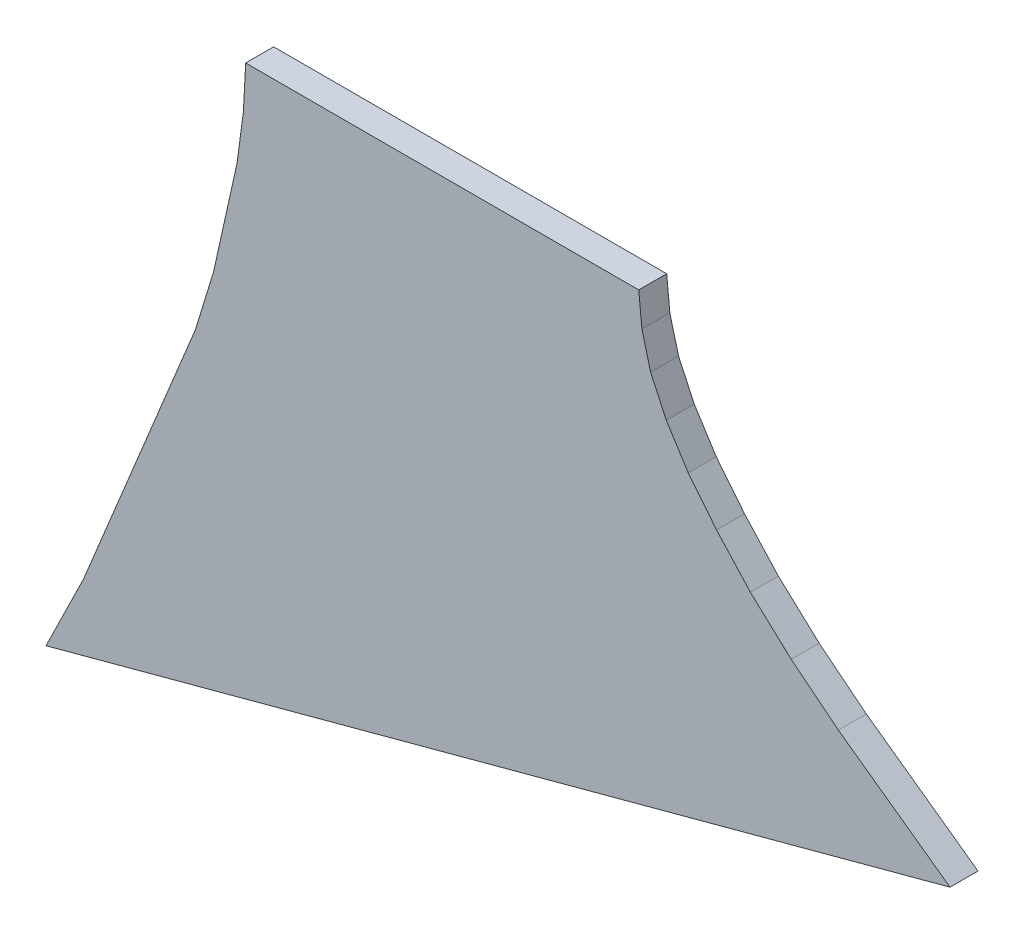
ISO-10303-21;
HEADER;
FILE_DESCRIPTION(('STEP AP214'),'2;1');
FILE_NAME('part.step','',(''),(''),'','','');
FILE_SCHEMA(('AUTOMOTIVE_DESIGN { 1 0 10303 214 1 1 1 1 }'));
ENDSEC;
DATA;
#1=APPLICATION_CONTEXT('core data for automotive mechanical design processes');
#2=APPLICATION_PROTOCOL_DEFINITION('international standard','automotive_design',2000,#1);
#3=PRODUCT_CONTEXT('',#1,'mechanical');
#4=PRODUCT('Part','Part','',(#3));
#5=PRODUCT_RELATED_PRODUCT_CATEGORY('part','',(#4));
#6=PRODUCT_DEFINITION_FORMATION('','',#4);
#7=PRODUCT_DEFINITION_CONTEXT('part definition',#1,'design');
#8=PRODUCT_DEFINITION('design','',#6,#7);
#9=PRODUCT_DEFINITION_SHAPE('','',#8);
#10=(LENGTH_UNIT() NAMED_UNIT(*) SI_UNIT(.MILLI.,.METRE.));
#11=(NAMED_UNIT(*) PLANE_ANGLE_UNIT() SI_UNIT($,.RADIAN.));
#12=(NAMED_UNIT(*) SI_UNIT($,.STERADIAN.) SOLID_ANGLE_UNIT());
#13=UNCERTAINTY_MEASURE_WITH_UNIT(LENGTH_MEASURE(1.E-05),#10,'distance_accuracy_value','');
#14=(GEOMETRIC_REPRESENTATION_CONTEXT(3) GLOBAL_UNCERTAINTY_ASSIGNED_CONTEXT((#13)) GLOBAL_UNIT_ASSIGNED_CONTEXT((#10,
#11,#12)) REPRESENTATION_CONTEXT('',''));
#15=CARTESIAN_POINT('',(0.,0.,0.));
#16=DIRECTION('',(0.,0.,1.));
#17=DIRECTION('',(1.,0.,0.));
#18=AXIS2_PLACEMENT_3D('',#15,#16,#17);
#19=CARTESIAN_POINT('',(100.940002441406,113.629997253418,0.));
#20=DIRECTION('',(0.998562416629939,-0.0536013068327242,0.));
#21=DIRECTION('',(-0.0536013068327242,-0.998562416629939,0.));
#22=AXIS2_PLACEMENT_3D('',#19,#20,#21);
#23=PLANE('',#22);
#24=DIRECTION('',(-0.0536013068327242,-0.998562416629939,0.));
#25=VECTOR('',#24,1.);
#26=CARTESIAN_POINT('',(100.940002441406,113.629997253418,0.03556));
#27=LINE('',#26,#25);
#28=CARTESIAN_POINT('',(100.940002441406,113.629997253418,0.03556));
#29=VERTEX_POINT('',#28);
#30=CARTESIAN_POINT('',(100.936996459961,113.573997497559,0.03556));
#31=VERTEX_POINT('',#30);
#32=EDGE_CURVE('E11',#29,#31,#27,.T.);
#33=ORIENTED_EDGE('',*,*,#32,.F.);
#34=DIRECTION('',(0.,0.,1.));
#35=VECTOR('',#34,1.);
#36=CARTESIAN_POINT('',(100.940002441406,113.629997253418,0.));
#37=LINE('',#36,#35);
#38=CARTESIAN_POINT('',(100.940002441406,113.629997253418,0.));
#39=VERTEX_POINT('',#38);
#40=EDGE_CURVE('E24',#39,#29,#37,.T.);
#41=ORIENTED_EDGE('',*,*,#40,.F.);
#42=DIRECTION('',(-0.0536013068327242,-0.998562416629939,0.));
#43=VECTOR('',#42,1.);
#44=CARTESIAN_POINT('',(100.940002441406,113.629997253418,0.));
#45=LINE('',#44,#43);
#46=CARTESIAN_POINT('',(100.936996459961,113.573997497559,0.));
#47=VERTEX_POINT('',#46);
#48=EDGE_CURVE('E154',#39,#47,#45,.T.);
#49=ORIENTED_EDGE('',*,*,#48,.T.);
#50=DIRECTION('',(0.,0.,1.));
#51=VECTOR('',#50,1.);
#52=CARTESIAN_POINT('',(100.936996459961,113.573997497559,0.));
#53=LINE('',#52,#51);
#54=EDGE_CURVE('E37',#47,#31,#53,.T.);
#55=ORIENTED_EDGE('',*,*,#54,.T.);
#56=EDGE_LOOP('',(#33,#41,#49,#55));
#57=FACE_BOUND('',#56,.T.);
#58=ADVANCED_FACE('F17',(#57),#23,.F.);
#59=CARTESIAN_POINT('',(100.936996459961,113.573997497559,0.));
#60=DIRECTION('',(0.991236705286771,-0.132097668761513,0.));
#61=DIRECTION('',(-0.132097668761513,-0.991236705286771,0.));
#62=AXIS2_PLACEMENT_3D('',#59,#60,#61);
#63=PLANE('',#62);
#64=DIRECTION('',(-0.132097668761513,-0.991236705286771,0.));
#65=VECTOR('',#64,1.);
#66=CARTESIAN_POINT('',(100.936996459961,113.573997497559,0.03556));
#67=LINE('',#66,#65);
#68=CARTESIAN_POINT('',(100.929000854492,113.513999938965,0.03556));
#69=VERTEX_POINT('',#68);
#70=EDGE_CURVE('E266',#31,#69,#67,.T.);
#71=ORIENTED_EDGE('',*,*,#70,.F.);
#72=ORIENTED_EDGE('',*,*,#54,.F.);
#73=DIRECTION('',(-0.132097668761513,-0.991236705286771,0.));
#74=VECTOR('',#73,1.);
#75=CARTESIAN_POINT('',(100.936996459961,113.573997497559,0.));
#76=LINE('',#75,#74);
#77=CARTESIAN_POINT('',(100.929000854492,113.513999938965,0.));
#78=VERTEX_POINT('',#77);
#79=EDGE_CURVE('E263',#47,#78,#76,.T.);
#80=ORIENTED_EDGE('',*,*,#79,.T.);
#81=DIRECTION('',(0.,0.,1.));
#82=VECTOR('',#81,1.);
#83=CARTESIAN_POINT('',(100.929000854492,113.513999938965,0.));
#84=LINE('',#83,#82);
#85=EDGE_CURVE('E261',#78,#69,#84,.T.);
#86=ORIENTED_EDGE('',*,*,#85,.T.);
#87=EDGE_LOOP('',(#71,#72,#80,#86));
#88=FACE_BOUND('',#87,.T.);
#89=ADVANCED_FACE('F274',(#88),#63,.F.);
#90=CARTESIAN_POINT('',(100.929000854492,113.513999938965,0.));
#91=DIRECTION('',(0.976189656233672,-0.216918775264809,0.));
#92=DIRECTION('',(-0.216918775264809,-0.976189656233672,0.));
#93=AXIS2_PLACEMENT_3D('',#90,#91,#92);
#94=PLANE('',#93);
#95=DIRECTION('',(-0.216918775264809,-0.976189656233672,0.));
#96=VECTOR('',#95,1.);
#97=CARTESIAN_POINT('',(100.929000854492,113.513999938965,0.03556));
#98=LINE('',#97,#96);
#99=CARTESIAN_POINT('',(100.899002075195,113.378997802734,0.03556));
#100=VERTEX_POINT('',#99);
#101=EDGE_CURVE('E258',#69,#100,#98,.T.);
#102=ORIENTED_EDGE('',*,*,#101,.F.);
#103=ORIENTED_EDGE('',*,*,#85,.F.);
#104=DIRECTION('',(-0.216918775264809,-0.976189656233672,0.));
#105=VECTOR('',#104,1.);
#106=CARTESIAN_POINT('',(100.929000854492,113.513999938965,0.));
#107=LINE('',#106,#105);
#108=CARTESIAN_POINT('',(100.899002075195,113.378997802734,0.));
#109=VERTEX_POINT('',#108);
#110=EDGE_CURVE('E255',#78,#109,#107,.T.);
#111=ORIENTED_EDGE('',*,*,#110,.T.);
#112=DIRECTION('',(0.,0.,1.));
#113=VECTOR('',#112,1.);
#114=CARTESIAN_POINT('',(100.899002075195,113.378997802734,0.));
#115=LINE('',#114,#113);
#116=EDGE_CURVE('E253',#109,#100,#115,.T.);
#117=ORIENTED_EDGE('',*,*,#116,.T.);
#118=EDGE_LOOP('',(#102,#103,#111,#117));
#119=FACE_BOUND('',#118,.T.);
#120=ADVANCED_FACE('F280',(#119),#94,.F.);
#121=CARTESIAN_POINT('',(100.899002075195,113.378997802734,0.));
#122=DIRECTION('',(0.956041485113537,-0.2932314422805,0.));
#123=DIRECTION('',(-0.2932314422805,-0.956041485113537,0.));
#124=AXIS2_PLACEMENT_3D('',#121,#122,#123);
#125=PLANE('',#124);
#126=DIRECTION('',(-0.2932314422805,-0.956041485113537,0.));
#127=VECTOR('',#126,1.);
#128=CARTESIAN_POINT('',(100.899002075195,113.378997802734,0.03556));
#129=LINE('',#128,#127);
#130=CARTESIAN_POINT('',(100.875999450684,113.304000854492,0.03556));
#131=VERTEX_POINT('',#130);
#132=EDGE_CURVE('E250',#100,#131,#129,.T.);
#133=ORIENTED_EDGE('',*,*,#132,.F.);
#134=ORIENTED_EDGE('',*,*,#116,.F.);
#135=DIRECTION('',(-0.2932314422805,-0.956041485113537,0.));
#136=VECTOR('',#135,1.);
#137=CARTESIAN_POINT('',(100.899002075195,113.378997802734,0.));
#138=LINE('',#137,#136);
#139=CARTESIAN_POINT('',(100.875999450684,113.304000854492,0.));
#140=VERTEX_POINT('',#139);
#141=EDGE_CURVE('E247',#109,#140,#138,.T.);
#142=ORIENTED_EDGE('',*,*,#141,.T.);
#143=DIRECTION('',(0.,0.,1.));
#144=VECTOR('',#143,1.);
#145=CARTESIAN_POINT('',(100.875999450684,113.304000854492,0.));
#146=LINE('',#145,#144);
#147=EDGE_CURVE('E245',#140,#131,#146,.T.);
#148=ORIENTED_EDGE('',*,*,#147,.T.);
#149=EDGE_LOOP('',(#133,#134,#142,#148));
#150=FACE_BOUND('',#149,.T.);
#151=ADVANCED_FACE('F282',(#150),#125,.F.);
#152=CARTESIAN_POINT('',(100.875999450684,113.304000854492,0.));
#153=DIRECTION('',(0.924735685881755,-0.380609920071456,0.));
#154=DIRECTION('',(-0.380609920071456,-0.924735685881755,0.));
#155=AXIS2_PLACEMENT_3D('',#152,#153,#154);
#156=PLANE('',#155);
#157=DIRECTION('',(-0.380609920071456,-0.924735685881755,0.));
#158=VECTOR('',#157,1.);
#159=CARTESIAN_POINT('',(100.875999450684,113.304000854492,0.03556));
#160=LINE('',#159,#158);
#161=CARTESIAN_POINT('',(100.734001159668,112.958999633789,0.03556));
#162=VERTEX_POINT('',#161);
#163=EDGE_CURVE('E242',#131,#162,#160,.T.);
#164=ORIENTED_EDGE('',*,*,#163,.F.);
#165=ORIENTED_EDGE('',*,*,#147,.F.);
#166=DIRECTION('',(-0.380609920071456,-0.924735685881755,0.));
#167=VECTOR('',#166,1.);
#168=CARTESIAN_POINT('',(100.875999450684,113.304000854492,0.));
#169=LINE('',#168,#167);
#170=CARTESIAN_POINT('',(100.734001159668,112.958999633789,0.));
#171=VERTEX_POINT('',#170);
#172=EDGE_CURVE('E239',#140,#171,#169,.T.);
#173=ORIENTED_EDGE('',*,*,#172,.T.);
#174=DIRECTION('',(0.,0.,1.));
#175=VECTOR('',#174,1.);
#176=CARTESIAN_POINT('',(100.734001159668,112.958999633789,0.));
#177=LINE('',#176,#175);
#178=EDGE_CURVE('E237',#171,#162,#177,.T.);
#179=ORIENTED_EDGE('',*,*,#178,.T.);
#180=EDGE_LOOP('',(#164,#165,#173,#179));
#181=FACE_BOUND('',#180,.T.);
#182=ADVANCED_FACE('F287',(#181),#156,.F.);
#183=CARTESIAN_POINT('',(100.734001159668,112.958999633789,0.));
#184=DIRECTION('',(0.898046925651893,-0.439899669614769,0.));
#185=DIRECTION('',(-0.439899669614769,-0.898046925651893,0.));
#186=AXIS2_PLACEMENT_3D('',#183,#184,#185);
#187=PLANE('',#186);
#188=DIRECTION('',(-0.439899669614769,-0.898046925651893,0.));
#189=VECTOR('',#188,1.);
#190=CARTESIAN_POINT('',(100.734001159668,112.958999633789,0.03556));
#191=LINE('',#190,#189);
#192=CARTESIAN_POINT('',(100.685997009277,112.861000061035,0.03556));
#193=VERTEX_POINT('',#192);
#194=EDGE_CURVE('E234',#162,#193,#191,.T.);
#195=ORIENTED_EDGE('',*,*,#194,.F.);
#196=ORIENTED_EDGE('',*,*,#178,.F.);
#197=DIRECTION('',(-0.439899669614769,-0.898046925651893,0.));
#198=VECTOR('',#197,1.);
#199=CARTESIAN_POINT('',(100.734001159668,112.958999633789,0.));
#200=LINE('',#199,#198);
#201=CARTESIAN_POINT('',(100.685997009277,112.861000061035,0.));
#202=VERTEX_POINT('',#201);
#203=EDGE_CURVE('E231',#171,#202,#200,.T.);
#204=ORIENTED_EDGE('',*,*,#203,.T.);
#205=DIRECTION('',(0.,0.,1.));
#206=VECTOR('',#205,1.);
#207=CARTESIAN_POINT('',(100.685997009277,112.861000061035,0.));
#208=LINE('',#207,#206);
#209=EDGE_CURVE('E229',#202,#193,#208,.T.);
#210=ORIENTED_EDGE('',*,*,#209,.T.);
#211=EDGE_LOOP('',(#195,#196,#204,#210));
#212=FACE_BOUND('',#211,.T.);
#213=ADVANCED_FACE('F290',(#212),#187,.F.);
#214=CARTESIAN_POINT('',(100.685997009277,112.861000061035,0.));
#215=DIRECTION('',(-0.25948977885427,0.965745854078682,0.));
#216=DIRECTION('',(0.965745854078682,0.25948977885427,0.));
#217=AXIS2_PLACEMENT_3D('',#214,#215,#216);
#218=PLANE('',#217);
#219=DIRECTION('',(0.965745854078682,0.25948977885427,0.));
#220=VECTOR('',#219,1.);
#221=CARTESIAN_POINT('',(100.685997009277,112.861000061035,0.03556));
#222=LINE('',#221,#220);
#223=CARTESIAN_POINT('',(101.835998535156,113.169998168945,0.03556));
#224=VERTEX_POINT('',#223);
#225=EDGE_CURVE('E226',#193,#224,#222,.T.);
#226=ORIENTED_EDGE('',*,*,#225,.F.);
#227=ORIENTED_EDGE('',*,*,#209,.F.);
#228=DIRECTION('',(0.965745854078682,0.25948977885427,0.));
#229=VECTOR('',#228,1.);
#230=CARTESIAN_POINT('',(100.685997009277,112.861000061035,0.));
#231=LINE('',#230,#229);
#232=CARTESIAN_POINT('',(101.835998535156,113.169998168945,0.));
#233=VERTEX_POINT('',#232);
#234=EDGE_CURVE('E223',#202,#233,#231,.T.);
#235=ORIENTED_EDGE('',*,*,#234,.T.);
#236=DIRECTION('',(0.,0.,1.));
#237=VECTOR('',#236,1.);
#238=CARTESIAN_POINT('',(101.835998535156,113.169998168945,0.));
#239=LINE('',#238,#237);
#240=EDGE_CURVE('E221',#233,#224,#239,.T.);
#241=ORIENTED_EDGE('',*,*,#240,.T.);
#242=EDGE_LOOP('',(#226,#227,#235,#241));
#243=FACE_BOUND('',#242,.T.);
#244=ADVANCED_FACE('F295',(#243),#218,.F.);
#245=CARTESIAN_POINT('',(101.835998535156,113.169998168945,0.));
#246=DIRECTION('',(-0.583423829249317,-0.812167861629641,0.));
#247=DIRECTION('',(-0.812167861629641,0.583423829249317,0.));
#248=AXIS2_PLACEMENT_3D('',#245,#246,#247);
#249=PLANE('',#248);
#250=DIRECTION('',(-0.812167861629641,0.583423829249317,0.));
#251=VECTOR('',#250,1.);
#252=CARTESIAN_POINT('',(101.835998535156,113.169998168945,0.03556));
#253=LINE('',#252,#251);
#254=CARTESIAN_POINT('',(101.694000244141,113.272003173828,0.03556));
#255=VERTEX_POINT('',#254);
#256=EDGE_CURVE('E218',#224,#255,#253,.T.);
#257=ORIENTED_EDGE('',*,*,#256,.F.);
#258=ORIENTED_EDGE('',*,*,#240,.F.);
#259=DIRECTION('',(-0.812167861629641,0.583423829249317,0.));
#260=VECTOR('',#259,1.);
#261=CARTESIAN_POINT('',(101.835998535156,113.169998168945,0.));
#262=LINE('',#261,#260);
#263=CARTESIAN_POINT('',(101.694000244141,113.272003173828,0.));
#264=VERTEX_POINT('',#263);
#265=EDGE_CURVE('E215',#233,#264,#262,.T.);
#266=ORIENTED_EDGE('',*,*,#265,.T.);
#267=DIRECTION('',(0.,0.,1.));
#268=VECTOR('',#267,1.);
#269=CARTESIAN_POINT('',(101.694000244141,113.272003173828,0.));
#270=LINE('',#269,#268);
#271=EDGE_CURVE('E213',#264,#255,#270,.T.);
#272=ORIENTED_EDGE('',*,*,#271,.T.);
#273=EDGE_LOOP('',(#257,#258,#266,#272));
#274=FACE_BOUND('',#273,.T.);
#275=ADVANCED_FACE('F298',(#274),#249,.F.);
#276=CARTESIAN_POINT('',(101.694000244141,113.272003173828,0.));
#277=DIRECTION('',(-0.624682937982234,-0.780878496946795,0.));
#278=DIRECTION('',(-0.780878496946795,0.624682937982234,0.));
#279=AXIS2_PLACEMENT_3D('',#276,#277,#278);
#280=PLANE('',#279);
#281=DIRECTION('',(-0.780878496946795,0.624682937982234,0.));
#282=VECTOR('',#281,1.);
#283=CARTESIAN_POINT('',(101.694000244141,113.272003173828,0.03556));
#284=LINE('',#283,#282);
#285=CARTESIAN_POINT('',(101.634002685547,113.319999694824,0.03556));
#286=VERTEX_POINT('',#285);
#287=EDGE_CURVE('E210',#255,#286,#284,.T.);
#288=ORIENTED_EDGE('',*,*,#287,.F.);
#289=ORIENTED_EDGE('',*,*,#271,.F.);
#290=DIRECTION('',(-0.780878496946795,0.624682937982234,0.));
#291=VECTOR('',#290,1.);
#292=CARTESIAN_POINT('',(101.694000244141,113.272003173828,0.));
#293=LINE('',#292,#291);
#294=CARTESIAN_POINT('',(101.634002685547,113.319999694824,0.));
#295=VERTEX_POINT('',#294);
#296=EDGE_CURVE('E207',#264,#295,#293,.T.);
#297=ORIENTED_EDGE('',*,*,#296,.T.);
#298=DIRECTION('',(0.,0.,1.));
#299=VECTOR('',#298,1.);
#300=CARTESIAN_POINT('',(101.634002685547,113.319999694824,0.));
#301=LINE('',#300,#299);
#302=EDGE_CURVE('E205',#295,#286,#301,.T.);
#303=ORIENTED_EDGE('',*,*,#302,.T.);
#304=EDGE_LOOP('',(#288,#289,#297,#303));
#305=FACE_BOUND('',#304,.T.);
#306=ADVANCED_FACE('F303',(#305),#280,.F.);
#307=CARTESIAN_POINT('',(101.634002685547,113.319999694824,0.));
#308=DIRECTION('',(-0.678239801706913,-0.734840643527947,0.));
#309=DIRECTION('',(-0.734840643527947,0.678239801706913,0.));
#310=AXIS2_PLACEMENT_3D('',#307,#308,#309);
#311=PLANE('',#310);
#312=DIRECTION('',(-0.734840643527947,0.678239801706913,0.));
#313=VECTOR('',#312,1.);
#314=CARTESIAN_POINT('',(101.634002685547,113.319999694824,0.03556));
#315=LINE('',#314,#313);
#316=CARTESIAN_POINT('',(101.582000732422,113.36799621582,0.03556));
#317=VERTEX_POINT('',#316);
#318=EDGE_CURVE('E202',#286,#317,#315,.T.);
#319=ORIENTED_EDGE('',*,*,#318,.F.);
#320=ORIENTED_EDGE('',*,*,#302,.F.);
#321=DIRECTION('',(-0.734840643527947,0.678239801706913,0.));
#322=VECTOR('',#321,1.);
#323=CARTESIAN_POINT('',(101.634002685547,113.319999694824,0.));
#324=LINE('',#323,#322);
#325=CARTESIAN_POINT('',(101.582000732422,113.36799621582,0.));
#326=VERTEX_POINT('',#325);
#327=EDGE_CURVE('E199',#295,#326,#324,.T.);
#328=ORIENTED_EDGE('',*,*,#327,.T.);
#329=DIRECTION('',(0.,0.,1.));
#330=VECTOR('',#329,1.);
#331=CARTESIAN_POINT('',(101.582000732422,113.36799621582,0.));
#332=LINE('',#331,#330);
#333=EDGE_CURVE('E197',#326,#317,#332,.T.);
#334=ORIENTED_EDGE('',*,*,#333,.T.);
#335=EDGE_LOOP('',(#319,#320,#328,#334));
#336=FACE_BOUND('',#335,.T.);
#337=ADVANCED_FACE('F306',(#336),#311,.F.);
#338=CARTESIAN_POINT('',(101.582000732422,113.36799621582,0.));
#339=DIRECTION('',(-0.737844750554932,-0.674970461634085,0.));
#340=DIRECTION('',(-0.674970461634085,0.737844750554932,0.));
#341=AXIS2_PLACEMENT_3D('',#338,#339,#340);
#342=PLANE('',#341);
#343=DIRECTION('',(-0.674970461634085,0.737844750554932,0.));
#344=VECTOR('',#343,1.);
#345=CARTESIAN_POINT('',(101.582000732422,113.36799621582,0.03556));
#346=LINE('',#345,#344);
#347=CARTESIAN_POINT('',(101.539001464844,113.415000915527,0.03556));
#348=VERTEX_POINT('',#347);
#349=EDGE_CURVE('E194',#317,#348,#346,.T.);
#350=ORIENTED_EDGE('',*,*,#349,.F.);
#351=ORIENTED_EDGE('',*,*,#333,.F.);
#352=DIRECTION('',(-0.674970461634085,0.737844750554932,0.));
#353=VECTOR('',#352,1.);
#354=CARTESIAN_POINT('',(101.582000732422,113.36799621582,0.));
#355=LINE('',#354,#353);
#356=CARTESIAN_POINT('',(101.539001464844,113.415000915527,0.));
#357=VERTEX_POINT('',#356);
#358=EDGE_CURVE('E191',#326,#357,#355,.T.);
#359=ORIENTED_EDGE('',*,*,#358,.T.);
#360=DIRECTION('',(0.,0.,1.));
#361=VECTOR('',#360,1.);
#362=CARTESIAN_POINT('',(101.539001464844,113.415000915527,0.));
#363=LINE('',#362,#361);
#364=EDGE_CURVE('E189',#357,#348,#363,.T.);
#365=ORIENTED_EDGE('',*,*,#364,.T.);
#366=EDGE_LOOP('',(#350,#351,#359,#365));
#367=FACE_BOUND('',#366,.T.);
#368=ADVANCED_FACE('F311',(#367),#342,.F.);
#369=CARTESIAN_POINT('',(101.539001464844,113.415000915527,0.));
#370=DIRECTION('',(-0.780830059953895,-0.624743481336458,0.));
#371=DIRECTION('',(-0.624743481336458,0.780830059953895,0.));
#372=AXIS2_PLACEMENT_3D('',#369,#370,#371);
#373=PLANE('',#372);
#374=DIRECTION('',(-0.624743481336458,0.780830059953895,0.));
#375=VECTOR('',#374,1.);
#376=CARTESIAN_POINT('',(101.539001464844,113.415000915527,0.03556));
#377=LINE('',#376,#375);
#378=CARTESIAN_POINT('',(101.502998352051,113.459999084473,0.03556));
#379=VERTEX_POINT('',#378);
#380=EDGE_CURVE('E186',#348,#379,#377,.T.);
#381=ORIENTED_EDGE('',*,*,#380,.F.);
#382=ORIENTED_EDGE('',*,*,#364,.F.);
#383=DIRECTION('',(-0.624743481336458,0.780830059953895,0.));
#384=VECTOR('',#383,1.);
#385=CARTESIAN_POINT('',(101.539001464844,113.415000915527,0.));
#386=LINE('',#385,#384);
#387=CARTESIAN_POINT('',(101.502998352051,113.459999084473,0.));
#388=VERTEX_POINT('',#387);
#389=EDGE_CURVE('E183',#357,#388,#386,.T.);
#390=ORIENTED_EDGE('',*,*,#389,.T.);
#391=DIRECTION('',(0.,0.,1.));
#392=VECTOR('',#391,1.);
#393=CARTESIAN_POINT('',(101.502998352051,113.459999084473,0.));
#394=LINE('',#393,#392);
#395=EDGE_CURVE('E181',#388,#379,#394,.T.);
#396=ORIENTED_EDGE('',*,*,#395,.T.);
#397=EDGE_LOOP('',(#381,#382,#390,#396));
#398=FACE_BOUND('',#397,.T.);
#399=ADVANCED_FACE('F314',(#398),#373,.F.);
#400=CARTESIAN_POINT('',(101.502998352051,113.459999084473,0.));
#401=DIRECTION('',(-0.84365546396574,-0.536884957994497,0.));
#402=DIRECTION('',(-0.536884957994497,0.84365546396574,0.));
#403=AXIS2_PLACEMENT_3D('',#400,#401,#402);
#404=PLANE('',#403);
#405=DIRECTION('',(-0.536884957994497,0.84365546396574,0.));
#406=VECTOR('',#405,1.);
#407=CARTESIAN_POINT('',(101.502998352051,113.459999084473,0.03556));
#408=LINE('',#407,#406);
#409=CARTESIAN_POINT('',(101.474998474121,113.503997802734,0.03556));
#410=VERTEX_POINT('',#409);
#411=EDGE_CURVE('E178',#379,#410,#408,.T.);
#412=ORIENTED_EDGE('',*,*,#411,.F.);
#413=ORIENTED_EDGE('',*,*,#395,.F.);
#414=DIRECTION('',(-0.536884957994497,0.84365546396574,0.));
#415=VECTOR('',#414,1.);
#416=CARTESIAN_POINT('',(101.502998352051,113.459999084473,0.));
#417=LINE('',#416,#415);
#418=CARTESIAN_POINT('',(101.474998474121,113.503997802734,0.));
#419=VERTEX_POINT('',#418);
#420=EDGE_CURVE('E175',#388,#419,#417,.T.);
#421=ORIENTED_EDGE('',*,*,#420,.T.);
#422=DIRECTION('',(0.,0.,1.));
#423=VECTOR('',#422,1.);
#424=CARTESIAN_POINT('',(101.474998474121,113.503997802734,0.));
#425=LINE('',#424,#423);
#426=EDGE_CURVE('E173',#419,#410,#425,.T.);
#427=ORIENTED_EDGE('',*,*,#426,.T.);
#428=EDGE_LOOP('',(#412,#413,#421,#427));
#429=FACE_BOUND('',#428,.T.);
#430=ADVANCED_FACE('F319',(#429),#404,.F.);
#431=CARTESIAN_POINT('',(101.474998474121,113.503997802734,0.));
#432=DIRECTION('',(-0.906745432636499,-0.421678456163993,0.));
#433=DIRECTION('',(-0.421678456163993,0.906745432636499,0.));
#434=AXIS2_PLACEMENT_3D('',#431,#432,#433);
#435=PLANE('',#434);
#436=DIRECTION('',(-0.421678456163993,0.906745432636499,0.));
#437=VECTOR('',#436,1.);
#438=CARTESIAN_POINT('',(101.474998474121,113.503997802734,0.03556));
#439=LINE('',#438,#437);
#440=CARTESIAN_POINT('',(101.455001831055,113.546997070312,0.03556));
#441=VERTEX_POINT('',#440);
#442=EDGE_CURVE('E170',#410,#441,#439,.T.);
#443=ORIENTED_EDGE('',*,*,#442,.F.);
#444=ORIENTED_EDGE('',*,*,#426,.F.);
#445=DIRECTION('',(-0.421678456163993,0.906745432636499,0.));
#446=VECTOR('',#445,1.);
#447=CARTESIAN_POINT('',(101.474998474121,113.503997802734,0.));
#448=LINE('',#447,#446);
#449=CARTESIAN_POINT('',(101.455001831055,113.546997070312,0.));
#450=VERTEX_POINT('',#449);
#451=EDGE_CURVE('E167',#419,#450,#448,.T.);
#452=ORIENTED_EDGE('',*,*,#451,.T.);
#453=DIRECTION('',(0.,0.,1.));
#454=VECTOR('',#453,1.);
#455=CARTESIAN_POINT('',(101.455001831055,113.546997070312,0.));
#456=LINE('',#455,#454);
#457=EDGE_CURVE('E165',#450,#441,#456,.T.);
#458=ORIENTED_EDGE('',*,*,#457,.T.);
#459=EDGE_LOOP('',(#443,#444,#452,#458));
#460=FACE_BOUND('',#459,.T.);
#461=ADVANCED_FACE('F322',(#460),#435,.F.);
#462=CARTESIAN_POINT('',(101.455001831055,113.546997070312,0.));
#463=DIRECTION('',(-0.967362993709961,-0.25339462977834,0.));
#464=DIRECTION('',(-0.25339462977834,0.967362993709961,0.));
#465=AXIS2_PLACEMENT_3D('',#462,#463,#464);
#466=PLANE('',#465);
#467=DIRECTION('',(-0.25339462977834,0.967362993709961,0.));
#468=VECTOR('',#467,1.);
#469=CARTESIAN_POINT('',(101.455001831055,113.546997070312,0.03556));
#470=LINE('',#469,#468);
#471=CARTESIAN_POINT('',(101.444000244141,113.588996887207,0.03556));
#472=VERTEX_POINT('',#471);
#473=EDGE_CURVE('E162',#441,#472,#470,.T.);
#474=ORIENTED_EDGE('',*,*,#473,.F.);
#475=ORIENTED_EDGE('',*,*,#457,.F.);
#476=DIRECTION('',(-0.25339462977834,0.967362993709961,0.));
#477=VECTOR('',#476,1.);
#478=CARTESIAN_POINT('',(101.455001831055,113.546997070312,0.));
#479=LINE('',#478,#477);
#480=CARTESIAN_POINT('',(101.444000244141,113.588996887207,0.));
#481=VERTEX_POINT('',#480);
#482=EDGE_CURVE('E160',#450,#481,#479,.T.);
#483=ORIENTED_EDGE('',*,*,#482,.T.);
#484=DIRECTION('',(0.,0.,1.));
#485=VECTOR('',#484,1.);
#486=CARTESIAN_POINT('',(101.444000244141,113.588996887207,0.));
#487=LINE('',#486,#485);
#488=EDGE_CURVE('E145',#481,#472,#487,.T.);
#489=ORIENTED_EDGE('',*,*,#488,.T.);
#490=EDGE_LOOP('',(#474,#475,#483,#489));
#491=FACE_BOUND('',#490,.T.);
#492=ADVANCED_FACE('F325',(#491),#466,.F.);
#493=CARTESIAN_POINT('',(101.444000244141,113.588996887207,0.));
#494=DIRECTION('',(-0.995279870977282,-0.0970462695184398,0.));
#495=DIRECTION('',(-0.0970462695184398,0.995279870977282,0.));
#496=AXIS2_PLACEMENT_3D('',#493,#494,#495);
#497=PLANE('',#496);
#498=DIRECTION('',(-0.0970462695184398,0.995279870977281,0.));
#499=VECTOR('',#498,1.);
#500=CARTESIAN_POINT('',(101.444000244141,113.588996887207,0.03556));
#501=LINE('',#500,#499);
#502=CARTESIAN_POINT('',(101.440002441406,113.629997253418,0.03556));
#503=VERTEX_POINT('',#502);
#504=EDGE_CURVE('E149',#472,#503,#501,.T.);
#505=ORIENTED_EDGE('',*,*,#504,.F.);
#506=ORIENTED_EDGE('',*,*,#488,.F.);
#507=DIRECTION('',(-0.0970462695184398,0.995279870977281,0.));
#508=VECTOR('',#507,1.);
#509=CARTESIAN_POINT('',(101.444000244141,113.588996887207,0.));
#510=LINE('',#509,#508);
#511=CARTESIAN_POINT('',(101.440002441406,113.629997253418,0.));
#512=VERTEX_POINT('',#511);
#513=EDGE_CURVE('E141',#481,#512,#510,.T.);
#514=ORIENTED_EDGE('',*,*,#513,.T.);
#515=DIRECTION('',(0.,0.,1.));
#516=VECTOR('',#515,1.);
#517=CARTESIAN_POINT('',(101.440002441406,113.629997253418,0.));
#518=LINE('',#517,#516);
#519=EDGE_CURVE('E131',#512,#503,#518,.T.);
#520=ORIENTED_EDGE('',*,*,#519,.T.);
#521=EDGE_LOOP('',(#505,#506,#514,#520));
#522=FACE_BOUND('',#521,.T.);
#523=ADVANCED_FACE('F144',(#522),#497,.F.);
#524=CARTESIAN_POINT('',(101.440002441406,113.629997253418,0.));
#525=DIRECTION('',(0.,-1.,0.));
#526=DIRECTION('',(-1.,0.,0.));
#527=AXIS2_PLACEMENT_3D('',#524,#525,#526);
#528=PLANE('',#527);
#529=DIRECTION('',(-1.,0.,0.));
#530=VECTOR('',#529,1.);
#531=CARTESIAN_POINT('',(101.440002441406,113.629997253418,0.03556));
#532=LINE('',#531,#530);
#533=EDGE_CURVE('E137',#503,#29,#532,.T.);
#534=ORIENTED_EDGE('',*,*,#533,.F.);
#535=ORIENTED_EDGE('',*,*,#519,.F.);
#536=DIRECTION('',(-1.,0.,0.));
#537=VECTOR('',#536,1.);
#538=CARTESIAN_POINT('',(101.440002441406,113.629997253418,0.));
#539=LINE('',#538,#537);
#540=EDGE_CURVE('E135',#512,#39,#539,.T.);
#541=ORIENTED_EDGE('',*,*,#540,.T.);
#542=ORIENTED_EDGE('',*,*,#40,.T.);
#543=EDGE_LOOP('',(#534,#535,#541,#542));
#544=FACE_BOUND('',#543,.T.);
#545=ADVANCED_FACE('F133',(#544),#528,.F.);
#546=CARTESIAN_POINT('',(100.940002441406,113.629997253418,0.));
#547=DIRECTION('',(0.,0.,1.));
#548=DIRECTION('',(1.,0.,0.));
#549=AXIS2_PLACEMENT_3D('',#546,#547,#548);
#550=PLANE('',#549);
#551=ORIENTED_EDGE('',*,*,#540,.F.);
#552=ORIENTED_EDGE('',*,*,#513,.F.);
#553=ORIENTED_EDGE('',*,*,#482,.F.);
#554=ORIENTED_EDGE('',*,*,#451,.F.);
#555=ORIENTED_EDGE('',*,*,#420,.F.);
#556=ORIENTED_EDGE('',*,*,#389,.F.);
#557=ORIENTED_EDGE('',*,*,#358,.F.);
#558=ORIENTED_EDGE('',*,*,#327,.F.);
#559=ORIENTED_EDGE('',*,*,#296,.F.);
#560=ORIENTED_EDGE('',*,*,#265,.F.);
#561=ORIENTED_EDGE('',*,*,#234,.F.);
#562=ORIENTED_EDGE('',*,*,#203,.F.);
#563=ORIENTED_EDGE('',*,*,#172,.F.);
#564=ORIENTED_EDGE('',*,*,#141,.F.);
#565=ORIENTED_EDGE('',*,*,#110,.F.);
#566=ORIENTED_EDGE('',*,*,#79,.F.);
#567=ORIENTED_EDGE('',*,*,#48,.F.);
#568=EDGE_LOOP('',(#551,#552,#553,#554,#555,#556,#557,#558,#559,#560,#561,#562,#563,#564,#565,
#566,#567));
#569=FACE_BOUND('',#568,.T.);
#570=ADVANCED_FACE('F152',(#569),#550,.F.);
#571=CARTESIAN_POINT('',(100.940002441406,113.629997253418,0.03556));
#572=DIRECTION('',(0.,0.,1.));
#573=DIRECTION('',(1.,0.,0.));
#574=AXIS2_PLACEMENT_3D('',#571,#572,#573);
#575=PLANE('',#574);
#576=ORIENTED_EDGE('',*,*,#32,.T.);
#577=ORIENTED_EDGE('',*,*,#70,.T.);
#578=ORIENTED_EDGE('',*,*,#101,.T.);
#579=ORIENTED_EDGE('',*,*,#132,.T.);
#580=ORIENTED_EDGE('',*,*,#163,.T.);
#581=ORIENTED_EDGE('',*,*,#194,.T.);
#582=ORIENTED_EDGE('',*,*,#225,.T.);
#583=ORIENTED_EDGE('',*,*,#256,.T.);
#584=ORIENTED_EDGE('',*,*,#287,.T.);
#585=ORIENTED_EDGE('',*,*,#318,.T.);
#586=ORIENTED_EDGE('',*,*,#349,.T.);
#587=ORIENTED_EDGE('',*,*,#380,.T.);
#588=ORIENTED_EDGE('',*,*,#411,.T.);
#589=ORIENTED_EDGE('',*,*,#442,.T.);
#590=ORIENTED_EDGE('',*,*,#473,.T.);
#591=ORIENTED_EDGE('',*,*,#504,.T.);
#592=ORIENTED_EDGE('',*,*,#533,.T.);
#593=EDGE_LOOP('',(#576,#577,#578,#579,#580,#581,#582,#583,#584,#585,#586,#587,#588,#589,#590,
#591,#592));
#594=FACE_BOUND('',#593,.T.);
#595=ADVANCED_FACE('F277',(#594),#575,.T.);
#596=CLOSED_SHELL('',(#58,#89,#120,#151,#182,#213,#244,#275,#306,#337,#368,#399,#430,#461,#492,
#523,#545,#570,#595));
#597=MANIFOLD_SOLID_BREP('B1',#596);
#598=ADVANCED_BREP_SHAPE_REPRESENTATION('',(#18,#597),#14);
#599=SHAPE_DEFINITION_REPRESENTATION(#9,#598);
ENDSEC;
END-ISO-10303-21;
